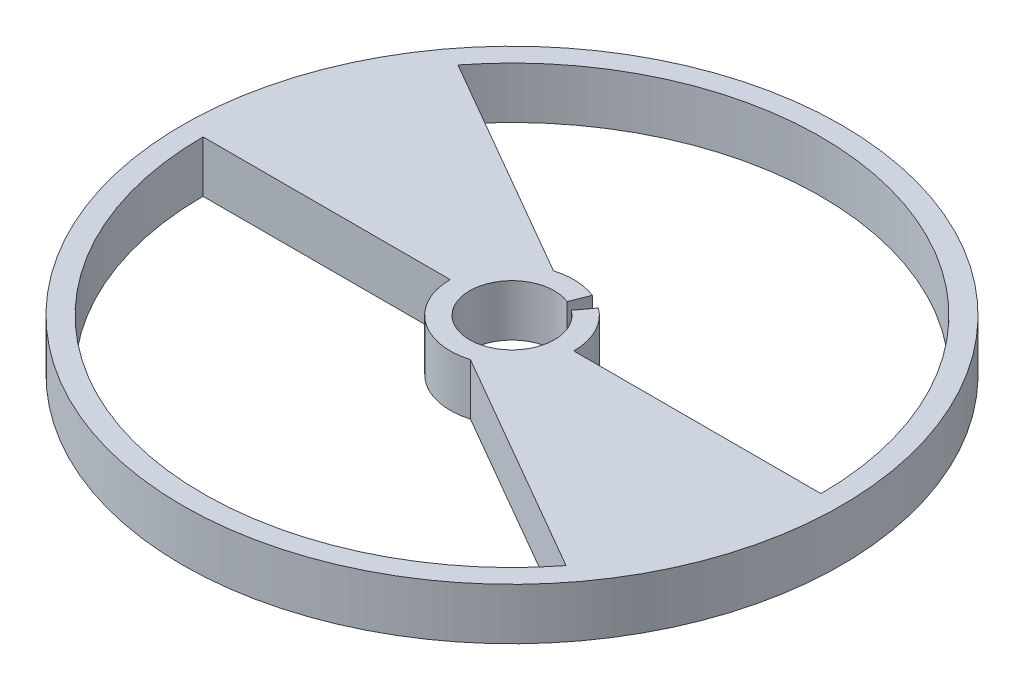
ISO-10303-21;
HEADER;
FILE_DESCRIPTION(('STEP AP214'),'2;1');
FILE_NAME('part.step','',(''),(''),'','','');
FILE_SCHEMA(('AUTOMOTIVE_DESIGN { 1 0 10303 214 1 1 1 1 }'));
ENDSEC;
DATA;
#1=APPLICATION_CONTEXT('core data for automotive mechanical design processes');
#2=APPLICATION_PROTOCOL_DEFINITION('international standard','automotive_design',2000,#1);
#3=PRODUCT_CONTEXT('',#1,'mechanical');
#4=PRODUCT('Part','Part','',(#3));
#5=PRODUCT_RELATED_PRODUCT_CATEGORY('part','',(#4));
#6=PRODUCT_DEFINITION_FORMATION('','',#4);
#7=PRODUCT_DEFINITION_CONTEXT('part definition',#1,'design');
#8=PRODUCT_DEFINITION('design','',#6,#7);
#9=PRODUCT_DEFINITION_SHAPE('','',#8);
#10=(LENGTH_UNIT() NAMED_UNIT(*) SI_UNIT(.MILLI.,.METRE.));
#11=(NAMED_UNIT(*) PLANE_ANGLE_UNIT() SI_UNIT($,.RADIAN.));
#12=(NAMED_UNIT(*) SI_UNIT($,.STERADIAN.) SOLID_ANGLE_UNIT());
#13=UNCERTAINTY_MEASURE_WITH_UNIT(LENGTH_MEASURE(1.E-05),#10,'distance_accuracy_value','');
#14=(GEOMETRIC_REPRESENTATION_CONTEXT(3) GLOBAL_UNCERTAINTY_ASSIGNED_CONTEXT((#13)) GLOBAL_UNIT_ASSIGNED_CONTEXT((#10,
#11,#12)) REPRESENTATION_CONTEXT('',''));
#15=CARTESIAN_POINT('',(0.,0.,0.));
#16=DIRECTION('',(0.,0.,1.));
#17=DIRECTION('',(1.,0.,0.));
#18=AXIS2_PLACEMENT_3D('',#15,#16,#17);
#19=CARTESIAN_POINT('',(0.,2.5,0.));
#20=DIRECTION('',(0.,1.,0.));
#21=DIRECTION('',(0.,0.,1.));
#22=AXIS2_PLACEMENT_3D('',#19,#20,#21);
#23=PLANE('',#22);
#24=CARTESIAN_POINT('',(0.,2.5,0.));
#25=DIRECTION('',(0.,1.,0.));
#26=DIRECTION('',(0.,0.,1.));
#27=AXIS2_PLACEMENT_3D('',#24,#25,#26);
#28=CIRCLE('',#27,16.);
#29=CARTESIAN_POINT('',(0.,2.5,16.));
#30=VERTEX_POINT('',#29);
#31=EDGE_CURVE('E11',#30,#30,#28,.T.);
#32=ORIENTED_EDGE('',*,*,#31,.T.);
#33=EDGE_LOOP('',(#32));
#34=FACE_BOUND('',#33,.T.);
#35=DIRECTION('',(-1.,0.,0.));
#36=VECTOR('',#35,1.);
#37=CARTESIAN_POINT('',(-3.,2.5,0.));
#38=LINE('',#37,#36);
#39=CARTESIAN_POINT('',(-3.,2.5,0.));
#40=VERTEX_POINT('',#39);
#41=CARTESIAN_POINT('',(-15.,2.5,0.));
#42=VERTEX_POINT('',#41);
#43=EDGE_CURVE('E179',#40,#42,#38,.T.);
#44=ORIENTED_EDGE('',*,*,#43,.F.);
#45=CARTESIAN_POINT('',(0.,2.5,0.));
#46=DIRECTION('',(0.,-1.,0.));
#47=DIRECTION('',(0.,0.,1.));
#48=AXIS2_PLACEMENT_3D('',#45,#46,#47);
#49=CIRCLE('',#48,3.);
#50=CARTESIAN_POINT('',(0.858729731856834,2.5,2.87447095090994));
#51=VERTEX_POINT('',#50);
#52=EDGE_CURVE('E164',#51,#40,#49,.T.);
#53=ORIENTED_EDGE('',*,*,#52,.F.);
#54=DIRECTION('',(-0.866025403784438,0.,-0.500000000000001));
#55=VECTOR('',#54,1.);
#56=CARTESIAN_POINT('',(0.858729731856834,2.5,2.87447095090994));
#57=LINE('',#56,#55);
#58=CARTESIAN_POINT('',(11.8372957531876,2.5,9.21294899864135));
#59=VERTEX_POINT('',#58);
#60=EDGE_CURVE('E160',#59,#51,#57,.T.);
#61=ORIENTED_EDGE('',*,*,#60,.F.);
#62=CARTESIAN_POINT('',(0.,2.5,0.));
#63=DIRECTION('',(0.,1.,0.));
#64=DIRECTION('',(0.,0.,1.));
#65=AXIS2_PLACEMENT_3D('',#62,#63,#64);
#66=CIRCLE('',#65,15.);
#67=EDGE_CURVE('E176',#42,#59,#66,.T.);
#68=ORIENTED_EDGE('',*,*,#67,.F.);
#69=EDGE_LOOP('',(#44,#53,#61,#68));
#70=FACE_BOUND('',#69,.T.);
#71=CARTESIAN_POINT('',(0.,2.5,0.));
#72=DIRECTION('',(0.,1.,0.));
#73=DIRECTION('',(0.,0.,1.));
#74=AXIS2_PLACEMENT_3D('',#71,#72,#73);
#75=CIRCLE('',#74,2.06);
#76=CARTESIAN_POINT('',(0.761124125647457,2.5,-1.91423354514474));
#77=VERTEX_POINT('',#76);
#78=CARTESIAN_POINT('',(1.23062954823214,2.5,-1.65201419939962));
#79=VERTEX_POINT('',#78);
#80=EDGE_CURVE('E143',#77,#79,#75,.T.);
#81=ORIENTED_EDGE('',*,*,#80,.F.);
#82=DIRECTION('',(0.369477730896824,0.,-0.929239585021718));
#83=VECTOR('',#82,1.);
#84=CARTESIAN_POINT('',(0.,2.5,0.));
#85=LINE('',#84,#83);
#86=CARTESIAN_POINT('',(1.10843319269047,2.5,-2.78771875506515));
#87=VERTEX_POINT('',#86);
#88=EDGE_CURVE('E134',#77,#87,#85,.T.);
#89=ORIENTED_EDGE('',*,*,#88,.T.);
#90=CARTESIAN_POINT('',(0.,2.5,0.));
#91=DIRECTION('',(0.,-1.,0.));
#92=DIRECTION('',(0.,0.,1.));
#93=AXIS2_PLACEMENT_3D('',#90,#91,#92);
#94=CIRCLE('',#93,3.);
#95=CARTESIAN_POINT('',(-0.858729731856856,2.5,-2.87447095090993));
#96=VERTEX_POINT('',#95);
#97=EDGE_CURVE('E208',#96,#87,#94,.T.);
#98=ORIENTED_EDGE('',*,*,#97,.F.);
#99=DIRECTION('',(0.866025403784442,0.,0.499999999999995));
#100=VECTOR('',#99,1.);
#101=CARTESIAN_POINT('',(-11.8372957531877,2.5,-9.21294899864126));
#102=LINE('',#101,#100);
#103=CARTESIAN_POINT('',(-11.8372957531877,2.5,-9.21294899864126));
#104=VERTEX_POINT('',#103);
#105=EDGE_CURVE('E212',#104,#96,#102,.T.);
#106=ORIENTED_EDGE('',*,*,#105,.F.);
#107=CARTESIAN_POINT('',(0.,2.5,0.));
#108=DIRECTION('',(0.,1.,0.));
#109=DIRECTION('',(0.,0.,1.));
#110=AXIS2_PLACEMENT_3D('',#107,#108,#109);
#111=CIRCLE('',#110,15.);
#112=CARTESIAN_POINT('',(15.,2.5,0.));
#113=VERTEX_POINT('',#112);
#114=EDGE_CURVE('E196',#113,#104,#111,.T.);
#115=ORIENTED_EDGE('',*,*,#114,.F.);
#116=DIRECTION('',(1.,0.,0.));
#117=VECTOR('',#116,1.);
#118=CARTESIAN_POINT('',(3.,2.5,0.));
#119=LINE('',#118,#117);
#120=CARTESIAN_POINT('',(3.,2.5,0.));
#121=VERTEX_POINT('',#120);
#122=EDGE_CURVE('E192',#121,#113,#119,.T.);
#123=ORIENTED_EDGE('',*,*,#122,.F.);
#124=CARTESIAN_POINT('',(1.79217895373613,2.5,-2.40584592145575));
#125=VERTEX_POINT('',#124);
#126=EDGE_CURVE('E211',#125,#121,#94,.T.);
#127=ORIENTED_EDGE('',*,*,#126,.F.);
#128=DIRECTION('',(0.597392984578709,0.,-0.801948640485251));
#129=VECTOR('',#128,1.);
#130=CARTESIAN_POINT('',(0.,2.5,0.));
#131=LINE('',#130,#129);
#132=EDGE_CURVE('E54',#79,#125,#131,.T.);
#133=ORIENTED_EDGE('',*,*,#132,.F.);
#134=EDGE_LOOP('',(#81,#89,#98,#106,#115,#123,#127,#133));
#135=FACE_BOUND('',#134,.T.);
#136=ADVANCED_FACE('F39',(#34,#70,#135),#23,.T.);
#137=CARTESIAN_POINT('',(0.,0.,0.));
#138=DIRECTION('',(0.,1.,0.));
#139=DIRECTION('',(0.,0.,1.));
#140=AXIS2_PLACEMENT_3D('',#137,#138,#139);
#141=PLANE('',#140);
#142=CARTESIAN_POINT('',(0.,0.,0.));
#143=DIRECTION('',(0.,1.,0.));
#144=DIRECTION('',(0.,0.,1.));
#145=AXIS2_PLACEMENT_3D('',#142,#143,#144);
#146=CIRCLE('',#145,16.);
#147=CARTESIAN_POINT('',(0.,0.,16.));
#148=VERTEX_POINT('',#147);
#149=EDGE_CURVE('E43',#148,#148,#146,.T.);
#150=ORIENTED_EDGE('',*,*,#149,.F.);
#151=EDGE_LOOP('',(#150));
#152=FACE_BOUND('',#151,.T.);
#153=CARTESIAN_POINT('',(0.,0.,0.));
#154=DIRECTION('',(0.,-1.,0.));
#155=DIRECTION('',(0.,0.,1.));
#156=AXIS2_PLACEMENT_3D('',#153,#154,#155);
#157=CIRCLE('',#156,3.);
#158=CARTESIAN_POINT('',(0.858729731856834,0.,2.87447095090994));
#159=VERTEX_POINT('',#158);
#160=CARTESIAN_POINT('',(-3.,0.,0.));
#161=VERTEX_POINT('',#160);
#162=EDGE_CURVE('E171',#159,#161,#157,.T.);
#163=ORIENTED_EDGE('',*,*,#162,.T.);
#164=DIRECTION('',(-1.,0.,0.));
#165=VECTOR('',#164,1.);
#166=CARTESIAN_POINT('',(-3.,0.,0.));
#167=LINE('',#166,#165);
#168=CARTESIAN_POINT('',(-15.,0.,0.));
#169=VERTEX_POINT('',#168);
#170=EDGE_CURVE('E168',#161,#169,#167,.T.);
#171=ORIENTED_EDGE('',*,*,#170,.T.);
#172=CARTESIAN_POINT('',(0.,0.,0.));
#173=DIRECTION('',(0.,1.,0.));
#174=DIRECTION('',(0.,0.,1.));
#175=AXIS2_PLACEMENT_3D('',#172,#173,#174);
#176=CIRCLE('',#175,15.);
#177=CARTESIAN_POINT('',(11.8372957531876,0.,9.21294899864135));
#178=VERTEX_POINT('',#177);
#179=EDGE_CURVE('E165',#169,#178,#176,.T.);
#180=ORIENTED_EDGE('',*,*,#179,.T.);
#181=DIRECTION('',(-0.866025403784438,0.,-0.500000000000001));
#182=VECTOR('',#181,1.);
#183=CARTESIAN_POINT('',(0.858729731856834,0.,2.87447095090994));
#184=LINE('',#183,#182);
#185=EDGE_CURVE('E161',#178,#159,#184,.T.);
#186=ORIENTED_EDGE('',*,*,#185,.T.);
#187=EDGE_LOOP('',(#163,#171,#180,#186));
#188=FACE_BOUND('',#187,.T.);
#189=DIRECTION('',(0.369477730896824,0.,-0.929239585021718));
#190=VECTOR('',#189,1.);
#191=CARTESIAN_POINT('',(0.,0.,0.));
#192=LINE('',#191,#190);
#193=CARTESIAN_POINT('',(0.761124125647457,0.,-1.91423354514474));
#194=VERTEX_POINT('',#193);
#195=CARTESIAN_POINT('',(1.10843319269047,0.,-2.78771875506515));
#196=VERTEX_POINT('',#195);
#197=EDGE_CURVE('E62',#194,#196,#192,.T.);
#198=ORIENTED_EDGE('',*,*,#197,.F.);
#199=CARTESIAN_POINT('',(0.,0.,0.));
#200=DIRECTION('',(0.,1.,0.));
#201=DIRECTION('',(0.,0.,1.));
#202=AXIS2_PLACEMENT_3D('',#199,#200,#201);
#203=CIRCLE('',#202,2.06);
#204=CARTESIAN_POINT('',(1.23062954823214,0.,-1.65201419939962));
#205=VERTEX_POINT('',#204);
#206=EDGE_CURVE('E141',#194,#205,#203,.T.);
#207=ORIENTED_EDGE('',*,*,#206,.T.);
#208=DIRECTION('',(0.597392984578709,0.,-0.801948640485251));
#209=VECTOR('',#208,1.);
#210=CARTESIAN_POINT('',(0.,0.,0.));
#211=LINE('',#210,#209);
#212=CARTESIAN_POINT('',(1.79217895373613,0.,-2.40584592145575));
#213=VERTEX_POINT('',#212);
#214=EDGE_CURVE('E126',#205,#213,#211,.T.);
#215=ORIENTED_EDGE('',*,*,#214,.T.);
#216=CARTESIAN_POINT('',(0.,0.,0.));
#217=DIRECTION('',(0.,-1.,0.));
#218=DIRECTION('',(0.,0.,1.));
#219=AXIS2_PLACEMENT_3D('',#216,#217,#218);
#220=CIRCLE('',#219,3.);
#221=CARTESIAN_POINT('',(3.,0.,0.));
#222=VERTEX_POINT('',#221);
#223=EDGE_CURVE('E199',#213,#222,#220,.T.);
#224=ORIENTED_EDGE('',*,*,#223,.T.);
#225=DIRECTION('',(1.,0.,0.));
#226=VECTOR('',#225,1.);
#227=CARTESIAN_POINT('',(3.,0.,0.));
#228=LINE('',#227,#226);
#229=CARTESIAN_POINT('',(15.,0.,0.));
#230=VERTEX_POINT('',#229);
#231=EDGE_CURVE('E193',#222,#230,#228,.T.);
#232=ORIENTED_EDGE('',*,*,#231,.T.);
#233=CARTESIAN_POINT('',(0.,0.,0.));
#234=DIRECTION('',(0.,1.,0.));
#235=DIRECTION('',(0.,0.,1.));
#236=AXIS2_PLACEMENT_3D('',#233,#234,#235);
#237=CIRCLE('',#236,15.);
#238=CARTESIAN_POINT('',(-11.8372957531877,0.,-9.21294899864126));
#239=VERTEX_POINT('',#238);
#240=EDGE_CURVE('E203',#230,#239,#237,.T.);
#241=ORIENTED_EDGE('',*,*,#240,.T.);
#242=DIRECTION('',(0.866025403784442,0.,0.499999999999995));
#243=VECTOR('',#242,1.);
#244=CARTESIAN_POINT('',(-11.8372957531877,0.,-9.21294899864126));
#245=LINE('',#244,#243);
#246=CARTESIAN_POINT('',(-0.858729731856856,0.,-2.87447095090993));
#247=VERTEX_POINT('',#246);
#248=EDGE_CURVE('E200',#239,#247,#245,.T.);
#249=ORIENTED_EDGE('',*,*,#248,.T.);
#250=EDGE_CURVE('E197',#247,#196,#220,.T.);
#251=ORIENTED_EDGE('',*,*,#250,.T.);
#252=EDGE_LOOP('',(#198,#207,#215,#224,#232,#241,#249,#251));
#253=FACE_BOUND('',#252,.T.);
#254=ADVANCED_FACE('F145',(#152,#188,#253),#141,.F.);
#255=CARTESIAN_POINT('',(0.,2.5,0.));
#256=DIRECTION('',(0.,-1.,0.));
#257=DIRECTION('',(0.,0.,-1.));
#258=AXIS2_PLACEMENT_3D('',#255,#256,#257);
#259=CYLINDRICAL_SURFACE('',#258,2.06);
#260=ORIENTED_EDGE('',*,*,#206,.F.);
#261=DIRECTION('',(0.,1.,0.));
#262=VECTOR('',#261,1.);
#263=CARTESIAN_POINT('',(0.761124125647457,0.,-1.91423354514474));
#264=LINE('',#263,#262);
#265=EDGE_CURVE('E206',#194,#77,#264,.T.);
#266=ORIENTED_EDGE('',*,*,#265,.T.);
#267=ORIENTED_EDGE('',*,*,#80,.T.);
#268=DIRECTION('',(0.,1.,0.));
#269=VECTOR('',#268,1.);
#270=CARTESIAN_POINT('',(1.23062954823214,0.,-1.65201419939962));
#271=LINE('',#270,#269);
#272=EDGE_CURVE('E129',#205,#79,#271,.T.);
#273=ORIENTED_EDGE('',*,*,#272,.F.);
#274=EDGE_LOOP('',(#260,#266,#267,#273));
#275=FACE_BOUND('',#274,.T.);
#276=ADVANCED_FACE('F139',(#275),#259,.F.);
#277=CARTESIAN_POINT('',(0.,2.5,0.));
#278=DIRECTION('',(0.,-1.,0.));
#279=DIRECTION('',(0.,0.,-1.));
#280=AXIS2_PLACEMENT_3D('',#277,#278,#279);
#281=CYLINDRICAL_SURFACE('',#280,3.);
#282=ORIENTED_EDGE('',*,*,#97,.T.);
#283=DIRECTION('',(0.,1.,0.));
#284=VECTOR('',#283,1.);
#285=CARTESIAN_POINT('',(1.10843319269047,0.,-2.78771875506515));
#286=LINE('',#285,#284);
#287=EDGE_CURVE('E216',#196,#87,#286,.T.);
#288=ORIENTED_EDGE('',*,*,#287,.F.);
#289=ORIENTED_EDGE('',*,*,#250,.F.);
#290=DIRECTION('',(0.,-1.,0.));
#291=VECTOR('',#290,1.);
#292=CARTESIAN_POINT('',(-0.858729731856856,2.5,-2.87447095090993));
#293=LINE('',#292,#291);
#294=EDGE_CURVE('E184',#96,#247,#293,.T.);
#295=ORIENTED_EDGE('',*,*,#294,.F.);
#296=EDGE_LOOP('',(#282,#288,#289,#295));
#297=FACE_BOUND('',#296,.T.);
#298=ADVANCED_FACE('F227',(#297),#281,.T.);
#299=CARTESIAN_POINT('',(0.,2.5,0.));
#300=DIRECTION('',(0.,-1.,0.));
#301=DIRECTION('',(0.,0.,-1.));
#302=AXIS2_PLACEMENT_3D('',#299,#300,#301);
#303=CYLINDRICAL_SURFACE('',#302,16.);
#304=ORIENTED_EDGE('',*,*,#31,.F.);
#305=EDGE_LOOP('',(#304));
#306=FACE_BOUND('',#305,.T.);
#307=ORIENTED_EDGE('',*,*,#149,.T.);
#308=EDGE_LOOP('',(#307));
#309=FACE_BOUND('',#308,.T.);
#310=ADVANCED_FACE('F41',(#306,#309),#303,.T.);
#311=CARTESIAN_POINT('',(0.,2.5,0.));
#312=DIRECTION('',(0.,-1.,0.));
#313=DIRECTION('',(0.,0.,-1.));
#314=AXIS2_PLACEMENT_3D('',#311,#312,#313);
#315=CYLINDRICAL_SURFACE('',#314,3.);
#316=ORIENTED_EDGE('',*,*,#162,.F.);
#317=DIRECTION('',(0.,-1.,0.));
#318=VECTOR('',#317,1.);
#319=CARTESIAN_POINT('',(0.858729731856834,2.5,2.87447095090994));
#320=LINE('',#319,#318);
#321=EDGE_CURVE('E157',#51,#159,#320,.T.);
#322=ORIENTED_EDGE('',*,*,#321,.F.);
#323=ORIENTED_EDGE('',*,*,#52,.T.);
#324=DIRECTION('',(0.,-1.,0.));
#325=VECTOR('',#324,1.);
#326=CARTESIAN_POINT('',(-3.,2.5,0.));
#327=LINE('',#326,#325);
#328=EDGE_CURVE('E147',#40,#161,#327,.T.);
#329=ORIENTED_EDGE('',*,*,#328,.T.);
#330=EDGE_LOOP('',(#316,#322,#323,#329));
#331=FACE_BOUND('',#330,.T.);
#332=ADVANCED_FACE('F265',(#331),#315,.T.);
#333=CARTESIAN_POINT('',(-3.,2.5,0.));
#334=DIRECTION('',(0.,0.,1.));
#335=DIRECTION('',(1.,0.,0.));
#336=AXIS2_PLACEMENT_3D('',#333,#334,#335);
#337=PLANE('',#336);
#338=ORIENTED_EDGE('',*,*,#170,.F.);
#339=ORIENTED_EDGE('',*,*,#328,.F.);
#340=ORIENTED_EDGE('',*,*,#43,.T.);
#341=DIRECTION('',(0.,-1.,0.));
#342=VECTOR('',#341,1.);
#343=CARTESIAN_POINT('',(-15.,2.5,0.));
#344=LINE('',#343,#342);
#345=EDGE_CURVE('E151',#42,#169,#344,.T.);
#346=ORIENTED_EDGE('',*,*,#345,.T.);
#347=EDGE_LOOP('',(#338,#339,#340,#346));
#348=FACE_BOUND('',#347,.T.);
#349=ADVANCED_FACE('F268',(#348),#337,.T.);
#350=CARTESIAN_POINT('',(0.,2.5,0.));
#351=DIRECTION('',(0.,-1.,0.));
#352=DIRECTION('',(0.,0.,-1.));
#353=AXIS2_PLACEMENT_3D('',#350,#351,#352);
#354=CYLINDRICAL_SURFACE('',#353,15.);
#355=ORIENTED_EDGE('',*,*,#179,.F.);
#356=ORIENTED_EDGE('',*,*,#345,.F.);
#357=ORIENTED_EDGE('',*,*,#67,.T.);
#358=DIRECTION('',(0.,-1.,0.));
#359=VECTOR('',#358,1.);
#360=CARTESIAN_POINT('',(11.8372957531876,2.5,9.21294899864135));
#361=LINE('',#360,#359);
#362=EDGE_CURVE('E155',#59,#178,#361,.T.);
#363=ORIENTED_EDGE('',*,*,#362,.T.);
#364=EDGE_LOOP('',(#355,#356,#357,#363));
#365=FACE_BOUND('',#364,.T.);
#366=ADVANCED_FACE('F272',(#365),#354,.F.);
#367=CARTESIAN_POINT('',(0.858729731856834,2.5,2.87447095090994));
#368=DIRECTION('',(-0.500000000000001,0.,0.866025403784438));
#369=DIRECTION('',(0.866025403784438,0.,0.500000000000001));
#370=AXIS2_PLACEMENT_3D('',#367,#368,#369);
#371=PLANE('',#370);
#372=ORIENTED_EDGE('',*,*,#185,.F.);
#373=ORIENTED_EDGE('',*,*,#362,.F.);
#374=ORIENTED_EDGE('',*,*,#60,.T.);
#375=ORIENTED_EDGE('',*,*,#321,.T.);
#376=EDGE_LOOP('',(#372,#373,#374,#375));
#377=FACE_BOUND('',#376,.T.);
#378=ADVANCED_FACE('F276',(#377),#371,.T.);
#379=CARTESIAN_POINT('',(0.,2.5,0.));
#380=DIRECTION('',(0.,-1.,0.));
#381=DIRECTION('',(0.,0.,-1.));
#382=AXIS2_PLACEMENT_3D('',#379,#380,#381);
#383=CYLINDRICAL_SURFACE('',#382,15.);
#384=ORIENTED_EDGE('',*,*,#240,.F.);
#385=DIRECTION('',(0.,-1.,0.));
#386=VECTOR('',#385,1.);
#387=CARTESIAN_POINT('',(15.,2.5,0.));
#388=LINE('',#387,#386);
#389=EDGE_CURVE('E189',#113,#230,#388,.T.);
#390=ORIENTED_EDGE('',*,*,#389,.F.);
#391=ORIENTED_EDGE('',*,*,#114,.T.);
#392=DIRECTION('',(0.,-1.,0.));
#393=VECTOR('',#392,1.);
#394=CARTESIAN_POINT('',(-11.8372957531877,2.5,-9.21294899864126));
#395=LINE('',#394,#393);
#396=EDGE_CURVE('E174',#104,#239,#395,.T.);
#397=ORIENTED_EDGE('',*,*,#396,.T.);
#398=EDGE_LOOP('',(#384,#390,#391,#397));
#399=FACE_BOUND('',#398,.T.);
#400=ADVANCED_FACE('F237',(#399),#383,.F.);
#401=CARTESIAN_POINT('',(-11.8372957531877,2.5,-9.21294899864126));
#402=DIRECTION('',(0.499999999999995,0.,-0.866025403784442));
#403=DIRECTION('',(-0.866025403784442,0.,-0.499999999999995));
#404=AXIS2_PLACEMENT_3D('',#401,#402,#403);
#405=PLANE('',#404);
#406=ORIENTED_EDGE('',*,*,#248,.F.);
#407=ORIENTED_EDGE('',*,*,#396,.F.);
#408=ORIENTED_EDGE('',*,*,#105,.T.);
#409=ORIENTED_EDGE('',*,*,#294,.T.);
#410=EDGE_LOOP('',(#406,#407,#408,#409));
#411=FACE_BOUND('',#410,.T.);
#412=ADVANCED_FACE('F230',(#411),#405,.T.);
#413=DIRECTION('',(0.,1.,0.));
#414=VECTOR('',#413,1.);
#415=CARTESIAN_POINT('',(1.79217895373613,0.,-2.40584592145575));
#416=LINE('',#415,#414);
#417=EDGE_CURVE('E130',#213,#125,#416,.T.);
#418=ORIENTED_EDGE('',*,*,#417,.T.);
#419=ORIENTED_EDGE('',*,*,#126,.T.);
#420=DIRECTION('',(0.,-1.,0.));
#421=VECTOR('',#420,1.);
#422=CARTESIAN_POINT('',(3.,2.5,0.));
#423=LINE('',#422,#421);
#424=EDGE_CURVE('E186',#121,#222,#423,.T.);
#425=ORIENTED_EDGE('',*,*,#424,.T.);
#426=ORIENTED_EDGE('',*,*,#223,.F.);
#427=EDGE_LOOP('',(#418,#419,#425,#426));
#428=FACE_BOUND('',#427,.T.);
#429=ADVANCED_FACE('F243',(#428),#281,.T.);
#430=CARTESIAN_POINT('',(3.,2.5,0.));
#431=DIRECTION('',(0.,0.,-1.));
#432=DIRECTION('',(-1.,0.,0.));
#433=AXIS2_PLACEMENT_3D('',#430,#431,#432);
#434=PLANE('',#433);
#435=ORIENTED_EDGE('',*,*,#231,.F.);
#436=ORIENTED_EDGE('',*,*,#424,.F.);
#437=ORIENTED_EDGE('',*,*,#122,.T.);
#438=ORIENTED_EDGE('',*,*,#389,.T.);
#439=EDGE_LOOP('',(#435,#436,#437,#438));
#440=FACE_BOUND('',#439,.T.);
#441=ADVANCED_FACE('F240',(#440),#434,.T.);
#442=CARTESIAN_POINT('',(0.,0.,0.));
#443=DIRECTION('',(0.801948640485251,0.,0.597392984578709));
#444=DIRECTION('',(0.597392984578709,0.,-0.801948640485251));
#445=AXIS2_PLACEMENT_3D('',#442,#443,#444);
#446=PLANE('',#445);
#447=ORIENTED_EDGE('',*,*,#132,.T.);
#448=ORIENTED_EDGE('',*,*,#417,.F.);
#449=ORIENTED_EDGE('',*,*,#214,.F.);
#450=ORIENTED_EDGE('',*,*,#272,.T.);
#451=EDGE_LOOP('',(#447,#448,#449,#450));
#452=FACE_BOUND('',#451,.T.);
#453=ADVANCED_FACE('F128',(#452),#446,.F.);
#454=CARTESIAN_POINT('',(0.,0.,0.));
#455=DIRECTION('',(0.929239585021718,0.,0.369477730896824));
#456=DIRECTION('',(0.369477730896824,0.,-0.929239585021718));
#457=AXIS2_PLACEMENT_3D('',#454,#455,#456);
#458=PLANE('',#457);
#459=ORIENTED_EDGE('',*,*,#88,.F.);
#460=ORIENTED_EDGE('',*,*,#265,.F.);
#461=ORIENTED_EDGE('',*,*,#197,.T.);
#462=ORIENTED_EDGE('',*,*,#287,.T.);
#463=EDGE_LOOP('',(#459,#460,#461,#462));
#464=FACE_BOUND('',#463,.T.);
#465=ADVANCED_FACE('F328',(#464),#458,.T.);
#466=CLOSED_SHELL('',(#136,#254,#276,#298,#310,#332,#349,#366,#378,#400,#412,#429,#441,#453,#465));
#467=MANIFOLD_SOLID_BREP('B2',#466);
#468=ADVANCED_BREP_SHAPE_REPRESENTATION('',(#18,#467),#14);
#469=SHAPE_DEFINITION_REPRESENTATION(#9,#468);
ENDSEC;
END-ISO-10303-21;
